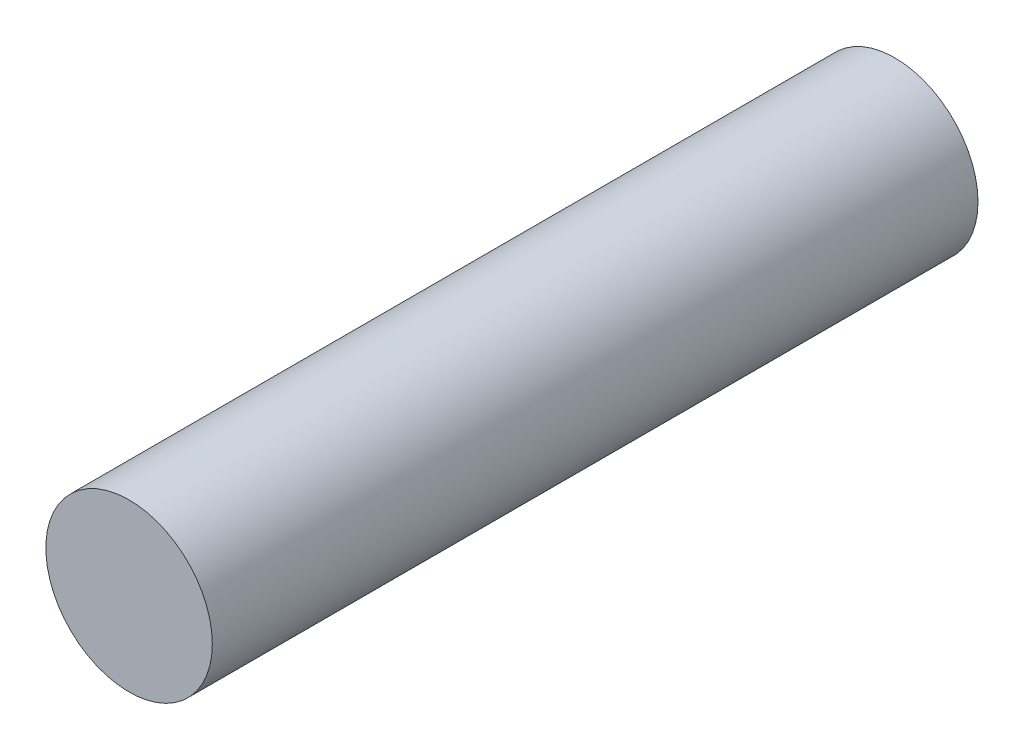
ISO-10303-21;
HEADER;
FILE_DESCRIPTION(('STEP AP214'),'2;1');
FILE_NAME('part.step','',(''),(''),'','','');
FILE_SCHEMA(('AUTOMOTIVE_DESIGN { 1 0 10303 214 1 1 1 1 }'));
ENDSEC;
DATA;
#1=APPLICATION_CONTEXT('core data for automotive mechanical design processes');
#2=APPLICATION_PROTOCOL_DEFINITION('international standard','automotive_design',2000,#1);
#3=PRODUCT_CONTEXT('',#1,'mechanical');
#4=PRODUCT('Part','Part','',(#3));
#5=PRODUCT_RELATED_PRODUCT_CATEGORY('part','',(#4));
#6=PRODUCT_DEFINITION_FORMATION('','',#4);
#7=PRODUCT_DEFINITION_CONTEXT('part definition',#1,'design');
#8=PRODUCT_DEFINITION('design','',#6,#7);
#9=PRODUCT_DEFINITION_SHAPE('','',#8);
#10=(LENGTH_UNIT() NAMED_UNIT(*) SI_UNIT(.MILLI.,.METRE.));
#11=(NAMED_UNIT(*) PLANE_ANGLE_UNIT() SI_UNIT($,.RADIAN.));
#12=(NAMED_UNIT(*) SI_UNIT($,.STERADIAN.) SOLID_ANGLE_UNIT());
#13=UNCERTAINTY_MEASURE_WITH_UNIT(LENGTH_MEASURE(1.E-05),#10,'distance_accuracy_value','');
#14=(GEOMETRIC_REPRESENTATION_CONTEXT(3) GLOBAL_UNCERTAINTY_ASSIGNED_CONTEXT((#13)) GLOBAL_UNIT_ASSIGNED_CONTEXT((#10,
#11,#12)) REPRESENTATION_CONTEXT('',''));
#15=CARTESIAN_POINT('',(0.,0.,0.));
#16=DIRECTION('',(0.,0.,1.));
#17=DIRECTION('',(1.,0.,0.));
#18=AXIS2_PLACEMENT_3D('',#15,#16,#17);
#19=CARTESIAN_POINT('',(0.,0.,10.));
#20=DIRECTION('',(0.,0.,-1.));
#21=DIRECTION('',(-1.,0.,0.));
#22=AXIS2_PLACEMENT_3D('',#19,#20,#21);
#23=CYLINDRICAL_SURFACE('',#22,2.5);
#24=CARTESIAN_POINT('',(0.,0.,0.));
#25=DIRECTION('',(0.,0.,1.));
#26=DIRECTION('',(1.,0.,0.));
#27=AXIS2_PLACEMENT_3D('',#24,#25,#26);
#28=CIRCLE('',#27,2.5);
#29=CARTESIAN_POINT('',(2.5,0.,0.));
#30=VERTEX_POINT('',#29);
#31=EDGE_CURVE('E10',#30,#30,#28,.T.);
#32=ORIENTED_EDGE('',*,*,#31,.T.);
#33=EDGE_LOOP('',(#32));
#34=FACE_BOUND('',#33,.T.);
#35=CARTESIAN_POINT('',(0.,0.,23.));
#36=DIRECTION('',(0.,0.,1.));
#37=DIRECTION('',(1.,0.,0.));
#38=AXIS2_PLACEMENT_3D('',#35,#36,#37);
#39=CIRCLE('',#38,2.5);
#40=CARTESIAN_POINT('',(2.5,0.,23.));
#41=VERTEX_POINT('',#40);
#42=EDGE_CURVE('E39',#41,#41,#39,.T.);
#43=ORIENTED_EDGE('',*,*,#42,.F.);
#44=EDGE_LOOP('',(#43));
#45=FACE_BOUND('',#44,.T.);
#46=ADVANCED_FACE('F33',(#34,#45),#23,.T.);
#47=CARTESIAN_POINT('',(0.,0.,0.));
#48=DIRECTION('',(0.,0.,1.));
#49=DIRECTION('',(1.,0.,0.));
#50=AXIS2_PLACEMENT_3D('',#47,#48,#49);
#51=PLANE('',#50);
#52=ORIENTED_EDGE('',*,*,#31,.F.);
#53=EDGE_LOOP('',(#52));
#54=FACE_BOUND('',#53,.T.);
#55=ADVANCED_FACE('F48',(#54),#51,.F.);
#56=CARTESIAN_POINT('',(0.,0.,23.));
#57=DIRECTION('',(0.,0.,1.));
#58=DIRECTION('',(1.,0.,0.));
#59=AXIS2_PLACEMENT_3D('',#56,#57,#58);
#60=PLANE('',#59);
#61=ORIENTED_EDGE('',*,*,#42,.T.);
#62=EDGE_LOOP('',(#61));
#63=FACE_BOUND('',#62,.T.);
#64=ADVANCED_FACE('F45',(#63),#60,.T.);
#65=CLOSED_SHELL('',(#46,#55,#64));
#66=MANIFOLD_SOLID_BREP('B2',#65);
#67=ADVANCED_BREP_SHAPE_REPRESENTATION('',(#18,#66),#14);
#68=SHAPE_DEFINITION_REPRESENTATION(#9,#67);
ENDSEC;
END-ISO-10303-21;
